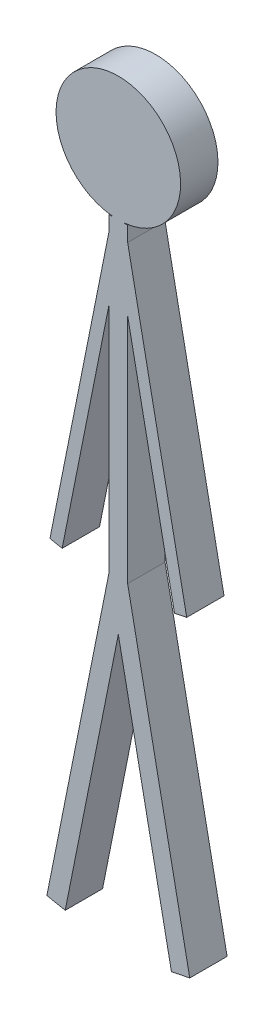
ISO-10303-21;
HEADER;
FILE_DESCRIPTION(('STEP AP214'),'2;1');
FILE_NAME('part.step','',(''),(''),'','','');
FILE_SCHEMA(('AUTOMOTIVE_DESIGN { 1 0 10303 214 1 1 1 1 }'));
ENDSEC;
DATA;
#1=APPLICATION_CONTEXT('core data for automotive mechanical design processes');
#2=APPLICATION_PROTOCOL_DEFINITION('international standard','automotive_design',2000,#1);
#3=PRODUCT_CONTEXT('',#1,'mechanical');
#4=PRODUCT('Part','Part','',(#3));
#5=PRODUCT_RELATED_PRODUCT_CATEGORY('part','',(#4));
#6=PRODUCT_DEFINITION_FORMATION('','',#4);
#7=PRODUCT_DEFINITION_CONTEXT('part definition',#1,'design');
#8=PRODUCT_DEFINITION('design','',#6,#7);
#9=PRODUCT_DEFINITION_SHAPE('','',#8);
#10=(LENGTH_UNIT() NAMED_UNIT(*) SI_UNIT(.MILLI.,.METRE.));
#11=(NAMED_UNIT(*) PLANE_ANGLE_UNIT() SI_UNIT($,.RADIAN.));
#12=(NAMED_UNIT(*) SI_UNIT($,.STERADIAN.) SOLID_ANGLE_UNIT());
#13=UNCERTAINTY_MEASURE_WITH_UNIT(LENGTH_MEASURE(1.E-05),#10,'distance_accuracy_value','');
#14=(GEOMETRIC_REPRESENTATION_CONTEXT(3) GLOBAL_UNCERTAINTY_ASSIGNED_CONTEXT((#13)) GLOBAL_UNIT_ASSIGNED_CONTEXT((#10,
#11,#12)) REPRESENTATION_CONTEXT('',''));
#15=CARTESIAN_POINT('',(0.,0.,0.));
#16=DIRECTION('',(0.,0.,1.));
#17=DIRECTION('',(1.,0.,0.));
#18=AXIS2_PLACEMENT_3D('',#15,#16,#17);
#19=CARTESIAN_POINT('',(1.8680061871912,6.69083844323595,5.715));
#20=DIRECTION('',(0.98058067569092,0.196116135138184,0.));
#21=DIRECTION('',(-0.196116135138184,0.98058067569092,0.));
#22=AXIS2_PLACEMENT_3D('',#19,#20,#21);
#23=PLANE('',#22);
#24=DIRECTION('',(0.,0.,-1.));
#25=VECTOR('',#24,1.);
#26=CARTESIAN_POINT('',(2.8575,1.74336937919196,5.715));
#27=LINE('',#26,#25);
#28=CARTESIAN_POINT('',(2.8575,1.74336937919196,5.715));
#29=VERTEX_POINT('',#28);
#30=CARTESIAN_POINT('',(2.8575,1.74336937919196,-5.715));
#31=VERTEX_POINT('',#30);
#32=EDGE_CURVE('E343',#29,#31,#27,.T.);
#33=ORIENTED_EDGE('',*,*,#32,.F.);
#34=DIRECTION('',(0.196116135138184,-0.98058067569092,0.));
#35=VECTOR('',#34,1.);
#36=CARTESIAN_POINT('',(1.8680061871912,6.69083844323595,5.715));
#37=LINE('',#36,#35);
#38=CARTESIAN_POINT('',(20.9180061871912,-88.5591615567641,5.715));
#39=VERTEX_POINT('',#38);
#40=EDGE_CURVE('E276',#29,#39,#37,.T.);
#41=ORIENTED_EDGE('',*,*,#40,.T.);
#42=DIRECTION('',(0.,0.,-1.));
#43=VECTOR('',#42,1.);
#44=CARTESIAN_POINT('',(20.9180061871912,-88.5591615567641,5.715));
#45=LINE('',#44,#43);
#46=CARTESIAN_POINT('',(20.9180061871912,-88.5591615567641,-5.715));
#47=VERTEX_POINT('',#46);
#48=EDGE_CURVE('E355',#39,#47,#45,.T.);
#49=ORIENTED_EDGE('',*,*,#48,.T.);
#50=DIRECTION('',(0.196116135138184,-0.98058067569092,0.));
#51=VECTOR('',#50,1.);
#52=CARTESIAN_POINT('',(1.8680061871912,6.69083844323595,-5.715));
#53=LINE('',#52,#51);
#54=EDGE_CURVE('E123',#31,#47,#53,.T.);
#55=ORIENTED_EDGE('',*,*,#54,.F.);
#56=EDGE_LOOP('',(#33,#41,#49,#55));
#57=FACE_BOUND('',#56,.T.);
#58=ADVANCED_FACE('F108',(#57),#23,.T.);
#59=CARTESIAN_POINT('',(-1.8680061871912,6.69083844323595,5.715));
#60=DIRECTION('',(0.98058067569092,-0.196116135138184,0.));
#61=DIRECTION('',(0.196116135138184,0.98058067569092,0.));
#62=AXIS2_PLACEMENT_3D('',#59,#60,#61);
#63=PLANE('',#62);
#64=DIRECTION('',(0.,0.,1.));
#65=VECTOR('',#64,1.);
#66=CARTESIAN_POINT('',(-2.8575,1.74336937919197,5.715));
#67=LINE('',#66,#65);
#68=CARTESIAN_POINT('',(-2.8575,1.74336937919197,-5.715));
#69=VERTEX_POINT('',#68);
#70=CARTESIAN_POINT('',(-2.8575,1.74336937919197,5.715));
#71=VERTEX_POINT('',#70);
#72=EDGE_CURVE('E338',#69,#71,#67,.T.);
#73=ORIENTED_EDGE('',*,*,#72,.F.);
#74=DIRECTION('',(-0.196116135138184,-0.98058067569092,0.));
#75=VECTOR('',#74,1.);
#76=CARTESIAN_POINT('',(-1.8680061871912,6.69083844323595,-5.715));
#77=LINE('',#76,#75);
#78=CARTESIAN_POINT('',(-20.9180061871912,-88.5591615567641,-5.715));
#79=VERTEX_POINT('',#78);
#80=EDGE_CURVE('E346',#69,#79,#77,.T.);
#81=ORIENTED_EDGE('',*,*,#80,.T.);
#82=DIRECTION('',(0.,0.,-1.));
#83=VECTOR('',#82,1.);
#84=CARTESIAN_POINT('',(-20.9180061871912,-88.5591615567641,5.715));
#85=LINE('',#84,#83);
#86=CARTESIAN_POINT('',(-20.9180061871912,-88.5591615567641,5.715));
#87=VERTEX_POINT('',#86);
#88=EDGE_CURVE('E359',#87,#79,#85,.T.);
#89=ORIENTED_EDGE('',*,*,#88,.F.);
#90=DIRECTION('',(-0.196116135138184,-0.98058067569092,0.));
#91=VECTOR('',#90,1.);
#92=CARTESIAN_POINT('',(-1.8680061871912,6.69083844323595,5.715));
#93=LINE('',#92,#91);
#94=EDGE_CURVE('E371',#71,#87,#93,.T.);
#95=ORIENTED_EDGE('',*,*,#94,.F.);
#96=EDGE_LOOP('',(#73,#81,#89,#95));
#97=FACE_BOUND('',#96,.T.);
#98=ADVANCED_FACE('F459',(#97),#63,.F.);
#99=CARTESIAN_POINT('',(1.8680061871912,5.94363596835947,5.715));
#100=DIRECTION('',(0.98058067569092,-0.196116135138184,0.));
#101=DIRECTION('',(0.196116135138184,0.98058067569092,0.));
#102=AXIS2_PLACEMENT_3D('',#99,#100,#101);
#103=PLANE('',#102);
#104=DIRECTION('',(-0.196116135138184,-0.98058067569092,0.));
#105=VECTOR('',#104,1.);
#106=CARTESIAN_POINT('',(1.8680061871912,5.94363596835947,-5.715));
#107=LINE('',#106,#105);
#108=CARTESIAN_POINT('',(-2.8575,-17.6838949675965,-5.715));
#109=VERTEX_POINT('',#108);
#110=CARTESIAN_POINT('',(-17.1819938128088,-89.3063640316406,-5.715));
#111=VERTEX_POINT('',#110);
#112=EDGE_CURVE('E383',#109,#111,#107,.T.);
#113=ORIENTED_EDGE('',*,*,#112,.F.);
#114=DIRECTION('',(0.,0.,1.));
#115=VECTOR('',#114,1.);
#116=CARTESIAN_POINT('',(-2.8575,-17.6838949675965,5.715));
#117=LINE('',#116,#115);
#118=CARTESIAN_POINT('',(-2.8575,-17.6838949675965,5.715));
#119=VERTEX_POINT('',#118);
#120=EDGE_CURVE('E397',#109,#119,#117,.T.);
#121=ORIENTED_EDGE('',*,*,#120,.T.);
#122=DIRECTION('',(-0.196116135138184,-0.98058067569092,0.));
#123=VECTOR('',#122,1.);
#124=CARTESIAN_POINT('',(1.8680061871912,5.94363596835947,5.715));
#125=LINE('',#124,#123);
#126=CARTESIAN_POINT('',(-17.1819938128088,-89.3063640316406,5.715));
#127=VERTEX_POINT('',#126);
#128=EDGE_CURVE('E374',#119,#127,#125,.T.);
#129=ORIENTED_EDGE('',*,*,#128,.T.);
#130=DIRECTION('',(0.,0.,-1.));
#131=VECTOR('',#130,1.);
#132=CARTESIAN_POINT('',(-17.1819938128088,-89.3063640316406,5.715));
#133=LINE('',#132,#131);
#134=EDGE_CURVE('E376',#127,#111,#133,.T.);
#135=ORIENTED_EDGE('',*,*,#134,.T.);
#136=EDGE_LOOP('',(#113,#121,#129,#135));
#137=FACE_BOUND('',#136,.T.);
#138=ADVANCED_FACE('F451',(#137),#103,.T.);
#139=CARTESIAN_POINT('',(0.,25.3672372057977,5.715));
#140=DIRECTION('',(0.,0.,-1.));
#141=DIRECTION('',(-1.,0.,0.));
#142=AXIS2_PLACEMENT_3D('',#139,#140,#141);
#143=CYLINDRICAL_SURFACE('',#142,19.05);
#144=CARTESIAN_POINT('',(0.,25.3672372057977,5.715));
#145=DIRECTION('',(0.,0.,1.));
#146=DIRECTION('',(1.,0.,0.));
#147=AXIS2_PLACEMENT_3D('',#144,#145,#146);
#148=CIRCLE('',#147,19.05);
#149=CARTESIAN_POINT('',(1.92325975811923,6.41457058859581,5.715));
#150=VERTEX_POINT('',#149);
#151=CARTESIAN_POINT('',(-1.92325975811923,6.41457058859581,5.715));
#152=VERTEX_POINT('',#151);
#153=EDGE_CURVE('E394',#150,#152,#148,.T.);
#154=ORIENTED_EDGE('',*,*,#153,.F.);
#155=DIRECTION('',(0.,0.,-1.));
#156=VECTOR('',#155,1.);
#157=CARTESIAN_POINT('',(1.92325975811923,6.41457058859581,5.715));
#158=LINE('',#157,#156);
#159=CARTESIAN_POINT('',(1.92325975811923,6.41457058859581,-5.715));
#160=VERTEX_POINT('',#159);
#161=EDGE_CURVE('E391',#150,#160,#158,.T.);
#162=ORIENTED_EDGE('',*,*,#161,.T.);
#163=CARTESIAN_POINT('',(0.,25.3672372057977,-5.715));
#164=DIRECTION('',(0.,0.,1.));
#165=DIRECTION('',(1.,0.,0.));
#166=AXIS2_PLACEMENT_3D('',#163,#164,#165);
#167=CIRCLE('',#166,19.05);
#168=CARTESIAN_POINT('',(-1.92325975811923,6.41457058859581,-5.715));
#169=VERTEX_POINT('',#168);
#170=EDGE_CURVE('E393',#160,#169,#167,.T.);
#171=ORIENTED_EDGE('',*,*,#170,.T.);
#172=DIRECTION('',(0.,0.,-1.));
#173=VECTOR('',#172,1.);
#174=CARTESIAN_POINT('',(-1.92325975811923,6.41457058859581,5.715));
#175=LINE('',#174,#173);
#176=EDGE_CURVE('E367',#152,#169,#175,.T.);
#177=ORIENTED_EDGE('',*,*,#176,.F.);
#178=EDGE_LOOP('',(#154,#162,#171,#177));
#179=FACE_BOUND('',#178,.T.);
#180=ADVANCED_FACE('F110',(#179),#143,.T.);
#181=CARTESIAN_POINT('',(0.,25.3672372057977,5.715));
#182=DIRECTION('',(0.,0.,1.));
#183=DIRECTION('',(1.,0.,0.));
#184=AXIS2_PLACEMENT_3D('',#181,#182,#183);
#185=PLANE('',#184);
#186=CARTESIAN_POINT('',(-1.94272643467885,6.31723720579771,5.715));
#187=VERTEX_POINT('',#186);
#188=EDGE_CURVE('E368',#152,#187,#93,.T.);
#189=ORIENTED_EDGE('',*,*,#188,.T.);
#190=DIRECTION('',(1.,0.,0.));
#191=VECTOR('',#190,1.);
#192=CARTESIAN_POINT('',(-2.8575,6.31723720579771,5.715));
#193=LINE('',#192,#191);
#194=CARTESIAN_POINT('',(-2.8575,6.31723720579771,5.715));
#195=VERTEX_POINT('',#194);
#196=EDGE_CURVE('E262',#195,#187,#193,.T.);
#197=ORIENTED_EDGE('',*,*,#196,.F.);
#198=DIRECTION('',(0.,-1.,0.));
#199=VECTOR('',#198,1.);
#200=CARTESIAN_POINT('',(-2.8575,6.31723720579771,5.715));
#201=LINE('',#200,#199);
#202=EDGE_CURVE('E279',#195,#71,#201,.T.);
#203=ORIENTED_EDGE('',*,*,#202,.T.);
#204=ORIENTED_EDGE('',*,*,#94,.T.);
#205=DIRECTION('',(-0.98058067569092,0.196116135138186,0.));
#206=VECTOR('',#205,1.);
#207=CARTESIAN_POINT('',(-17.1819938128088,-89.3063640316406,5.715));
#208=LINE('',#207,#206);
#209=EDGE_CURVE('E370',#127,#87,#208,.T.);
#210=ORIENTED_EDGE('',*,*,#209,.F.);
#211=ORIENTED_EDGE('',*,*,#128,.F.);
#212=CARTESIAN_POINT('',(-2.8575,-88.649814534111,5.715));
#213=VERTEX_POINT('',#212);
#214=EDGE_CURVE('E291',#119,#213,#201,.T.);
#215=ORIENTED_EDGE('',*,*,#214,.T.);
#216=DIRECTION('',(-0.196116135138184,-0.98058067569092,0.));
#217=VECTOR('',#216,1.);
#218=CARTESIAN_POINT('',(-2.8020092807868,-88.3723609380449,5.715));
#219=LINE('',#218,#217);
#220=CARTESIAN_POINT('',(-21.8520092807868,-183.622360938045,5.715));
#221=VERTEX_POINT('',#220);
#222=EDGE_CURVE('E315',#213,#221,#219,.T.);
#223=ORIENTED_EDGE('',*,*,#222,.T.);
#224=DIRECTION('',(-0.980580675690921,0.196116135138182,0.));
#225=VECTOR('',#224,1.);
#226=CARTESIAN_POINT('',(-16.2479907192132,-184.74316465036,5.715));
#227=LINE('',#226,#225);
#228=CARTESIAN_POINT('',(-16.2479907192132,-184.74316465036,5.715));
#229=VERTEX_POINT('',#228);
#230=EDGE_CURVE('E317',#229,#221,#227,.T.);
#231=ORIENTED_EDGE('',*,*,#230,.F.);
#232=DIRECTION('',(-0.196116135138184,-0.98058067569092,0.));
#233=VECTOR('',#232,1.);
#234=CARTESIAN_POINT('',(2.80200928078681,-89.4931646503597,5.715));
#235=LINE('',#234,#233);
#236=CARTESIAN_POINT('',(0.,-103.503211054294,5.715));
#237=VERTEX_POINT('',#236);
#238=EDGE_CURVE('E321',#237,#229,#235,.T.);
#239=ORIENTED_EDGE('',*,*,#238,.F.);
#240=DIRECTION('',(0.196116135138184,-0.98058067569092,0.));
#241=VECTOR('',#240,1.);
#242=CARTESIAN_POINT('',(-2.8020092807868,-89.4931646503597,5.715));
#243=LINE('',#242,#241);
#244=CARTESIAN_POINT('',(16.2479907192132,-184.74316465036,5.715));
#245=VERTEX_POINT('',#244);
#246=EDGE_CURVE('E293',#237,#245,#243,.T.);
#247=ORIENTED_EDGE('',*,*,#246,.T.);
#248=DIRECTION('',(-0.980580675690921,-0.196116135138182,0.));
#249=VECTOR('',#248,1.);
#250=CARTESIAN_POINT('',(21.8520092807868,-183.622360938045,5.715));
#251=LINE('',#250,#249);
#252=CARTESIAN_POINT('',(21.8520092807868,-183.622360938045,5.715));
#253=VERTEX_POINT('',#252);
#254=EDGE_CURVE('E295',#253,#245,#251,.T.);
#255=ORIENTED_EDGE('',*,*,#254,.F.);
#256=DIRECTION('',(0.196116135138184,-0.98058067569092,0.));
#257=VECTOR('',#256,1.);
#258=CARTESIAN_POINT('',(2.80200928078681,-88.3723609380449,5.715));
#259=LINE('',#258,#257);
#260=CARTESIAN_POINT('',(2.85749999999991,-88.64981453411,5.715));
#261=VERTEX_POINT('',#260);
#262=EDGE_CURVE('E299',#261,#253,#259,.T.);
#263=ORIENTED_EDGE('',*,*,#262,.F.);
#264=DIRECTION('',(0.,-1.,0.));
#265=VECTOR('',#264,1.);
#266=CARTESIAN_POINT('',(2.8575,6.31723720579771,5.715));
#267=LINE('',#266,#265);
#268=CARTESIAN_POINT('',(2.8575,-17.6838949675966,5.715));
#269=VERTEX_POINT('',#268);
#270=EDGE_CURVE('E277',#269,#261,#267,.T.);
#271=ORIENTED_EDGE('',*,*,#270,.F.);
#272=DIRECTION('',(0.196116135138184,-0.98058067569092,0.));
#273=VECTOR('',#272,1.);
#274=CARTESIAN_POINT('',(-1.8680061871912,5.94363596835947,5.715));
#275=LINE('',#274,#273);
#276=CARTESIAN_POINT('',(17.1819938128088,-89.3063640316406,5.715));
#277=VERTEX_POINT('',#276);
#278=EDGE_CURVE('E347',#269,#277,#275,.T.);
#279=ORIENTED_EDGE('',*,*,#278,.T.);
#280=DIRECTION('',(-0.98058067569092,-0.196116135138186,0.));
#281=VECTOR('',#280,1.);
#282=CARTESIAN_POINT('',(20.9180061871912,-88.5591615567641,5.715));
#283=LINE('',#282,#281);
#284=EDGE_CURVE('E349',#39,#277,#283,.T.);
#285=ORIENTED_EDGE('',*,*,#284,.F.);
#286=ORIENTED_EDGE('',*,*,#40,.F.);
#287=CARTESIAN_POINT('',(2.8575,6.31723720579771,5.715));
#288=VERTEX_POINT('',#287);
#289=EDGE_CURVE('E263',#288,#29,#267,.T.);
#290=ORIENTED_EDGE('',*,*,#289,.F.);
#291=CARTESIAN_POINT('',(1.94272643467885,6.31723720579771,5.715));
#292=VERTEX_POINT('',#291);
#293=EDGE_CURVE('E253',#292,#288,#193,.T.);
#294=ORIENTED_EDGE('',*,*,#293,.F.);
#295=EDGE_CURVE('E353',#150,#292,#37,.T.);
#296=ORIENTED_EDGE('',*,*,#295,.F.);
#297=ORIENTED_EDGE('',*,*,#153,.T.);
#298=EDGE_LOOP('',(#189,#197,#203,#204,#210,#211,#215,#223,#231,#239,#247,#255,#263,#271,#279,
#285,#286,#290,#294,#296,#297));
#299=FACE_BOUND('',#298,.T.);
#300=ADVANCED_FACE('F274',(#299),#185,.T.);
#301=CARTESIAN_POINT('',(0.,25.3672372057977,-5.715));
#302=DIRECTION('',(0.,0.,1.));
#303=DIRECTION('',(1.,0.,0.));
#304=AXIS2_PLACEMENT_3D('',#301,#302,#303);
#305=PLANE('',#304);
#306=CARTESIAN_POINT('',(1.94272643467885,6.31723720579771,-5.715));
#307=VERTEX_POINT('',#306);
#308=EDGE_CURVE('E350',#160,#307,#53,.T.);
#309=ORIENTED_EDGE('',*,*,#308,.T.);
#310=DIRECTION('',(1.,0.,0.));
#311=VECTOR('',#310,1.);
#312=CARTESIAN_POINT('',(-2.8575,6.31723720579771,-5.715));
#313=LINE('',#312,#311);
#314=CARTESIAN_POINT('',(2.8575,6.31723720579771,-5.715));
#315=VERTEX_POINT('',#314);
#316=EDGE_CURVE('E287',#307,#315,#313,.T.);
#317=ORIENTED_EDGE('',*,*,#316,.T.);
#318=DIRECTION('',(0.,-1.,0.));
#319=VECTOR('',#318,1.);
#320=CARTESIAN_POINT('',(2.8575,6.31723720579771,-5.715));
#321=LINE('',#320,#319);
#322=EDGE_CURVE('E269',#315,#31,#321,.T.);
#323=ORIENTED_EDGE('',*,*,#322,.T.);
#324=ORIENTED_EDGE('',*,*,#54,.T.);
#325=DIRECTION('',(-0.98058067569092,-0.196116135138186,0.));
#326=VECTOR('',#325,1.);
#327=CARTESIAN_POINT('',(20.9180061871912,-88.5591615567641,-5.715));
#328=LINE('',#327,#326);
#329=CARTESIAN_POINT('',(17.1819938128088,-89.3063640316406,-5.715));
#330=VERTEX_POINT('',#329);
#331=EDGE_CURVE('E358',#47,#330,#328,.T.);
#332=ORIENTED_EDGE('',*,*,#331,.T.);
#333=DIRECTION('',(0.196116135138184,-0.98058067569092,0.));
#334=VECTOR('',#333,1.);
#335=CARTESIAN_POINT('',(-1.8680061871912,5.94363596835947,-5.715));
#336=LINE('',#335,#334);
#337=CARTESIAN_POINT('',(2.8575,-17.6838949675966,-5.715));
#338=VERTEX_POINT('',#337);
#339=EDGE_CURVE('E356',#338,#330,#336,.T.);
#340=ORIENTED_EDGE('',*,*,#339,.F.);
#341=CARTESIAN_POINT('',(2.85749999999991,-88.64981453411,-5.715));
#342=VERTEX_POINT('',#341);
#343=EDGE_CURVE('E284',#338,#342,#321,.T.);
#344=ORIENTED_EDGE('',*,*,#343,.T.);
#345=DIRECTION('',(0.196116135138184,-0.98058067569092,0.));
#346=VECTOR('',#345,1.);
#347=CARTESIAN_POINT('',(2.80200928078681,-88.3723609380449,-5.715));
#348=LINE('',#347,#346);
#349=CARTESIAN_POINT('',(21.8520092807868,-183.622360938045,-5.715));
#350=VERTEX_POINT('',#349);
#351=EDGE_CURVE('E296',#342,#350,#348,.T.);
#352=ORIENTED_EDGE('',*,*,#351,.T.);
#353=DIRECTION('',(-0.980580675690921,-0.196116135138182,0.));
#354=VECTOR('',#353,1.);
#355=CARTESIAN_POINT('',(21.8520092807868,-183.622360938045,-5.715));
#356=LINE('',#355,#354);
#357=CARTESIAN_POINT('',(16.2479907192132,-184.74316465036,-5.715));
#358=VERTEX_POINT('',#357);
#359=EDGE_CURVE('E304',#350,#358,#356,.T.);
#360=ORIENTED_EDGE('',*,*,#359,.T.);
#361=DIRECTION('',(0.196116135138184,-0.98058067569092,0.));
#362=VECTOR('',#361,1.);
#363=CARTESIAN_POINT('',(-2.8020092807868,-89.4931646503597,-5.715));
#364=LINE('',#363,#362);
#365=CARTESIAN_POINT('',(0.,-103.503211054294,-5.715));
#366=VERTEX_POINT('',#365);
#367=EDGE_CURVE('E302',#366,#358,#364,.T.);
#368=ORIENTED_EDGE('',*,*,#367,.F.);
#369=DIRECTION('',(-0.196116135138184,-0.98058067569092,0.));
#370=VECTOR('',#369,1.);
#371=CARTESIAN_POINT('',(2.80200928078681,-89.4931646503597,-5.715));
#372=LINE('',#371,#370);
#373=CARTESIAN_POINT('',(-16.2479907192132,-184.74316465036,-5.715));
#374=VERTEX_POINT('',#373);
#375=EDGE_CURVE('E318',#366,#374,#372,.T.);
#376=ORIENTED_EDGE('',*,*,#375,.T.);
#377=DIRECTION('',(-0.980580675690921,0.196116135138182,0.));
#378=VECTOR('',#377,1.);
#379=CARTESIAN_POINT('',(-16.2479907192132,-184.74316465036,-5.715));
#380=LINE('',#379,#378);
#381=CARTESIAN_POINT('',(-21.8520092807868,-183.622360938045,-5.715));
#382=VERTEX_POINT('',#381);
#383=EDGE_CURVE('E326',#374,#382,#380,.T.);
#384=ORIENTED_EDGE('',*,*,#383,.T.);
#385=DIRECTION('',(-0.196116135138184,-0.98058067569092,0.));
#386=VECTOR('',#385,1.);
#387=CARTESIAN_POINT('',(-2.8020092807868,-88.3723609380449,-5.715));
#388=LINE('',#387,#386);
#389=CARTESIAN_POINT('',(-2.8575,-88.649814534111,-5.715));
#390=VERTEX_POINT('',#389);
#391=EDGE_CURVE('E324',#390,#382,#388,.T.);
#392=ORIENTED_EDGE('',*,*,#391,.F.);
#393=DIRECTION('',(0.,-1.,0.));
#394=VECTOR('',#393,1.);
#395=CARTESIAN_POINT('',(-2.8575,6.31723720579771,-5.715));
#396=LINE('',#395,#394);
#397=EDGE_CURVE('E285',#109,#390,#396,.T.);
#398=ORIENTED_EDGE('',*,*,#397,.F.);
#399=ORIENTED_EDGE('',*,*,#112,.T.);
#400=DIRECTION('',(-0.98058067569092,0.196116135138186,0.));
#401=VECTOR('',#400,1.);
#402=CARTESIAN_POINT('',(-17.1819938128088,-89.3063640316406,-5.715));
#403=LINE('',#402,#401);
#404=EDGE_CURVE('E380',#111,#79,#403,.T.);
#405=ORIENTED_EDGE('',*,*,#404,.T.);
#406=ORIENTED_EDGE('',*,*,#80,.F.);
#407=CARTESIAN_POINT('',(-2.8575,6.31723720579771,-5.715));
#408=VERTEX_POINT('',#407);
#409=EDGE_CURVE('E282',#408,#69,#396,.T.);
#410=ORIENTED_EDGE('',*,*,#409,.F.);
#411=CARTESIAN_POINT('',(-1.94272643467885,6.31723720579771,-5.715));
#412=VERTEX_POINT('',#411);
#413=EDGE_CURVE('E288',#408,#412,#313,.T.);
#414=ORIENTED_EDGE('',*,*,#413,.T.);
#415=EDGE_CURVE('E377',#169,#412,#77,.T.);
#416=ORIENTED_EDGE('',*,*,#415,.F.);
#417=ORIENTED_EDGE('',*,*,#170,.F.);
#418=EDGE_LOOP('',(#309,#317,#323,#324,#332,#340,#344,#352,#360,#368,#376,#384,#392,#398,#399,
#405,#406,#410,#414,#416,#417));
#419=FACE_BOUND('',#418,.T.);
#420=ADVANCED_FACE('F409',(#419),#305,.F.);
#421=DIRECTION('',(0.,0.,1.));
#422=VECTOR('',#421,1.);
#423=CARTESIAN_POINT('',(1.94272643467885,6.31723720579771,5.715));
#424=LINE('',#423,#422);
#425=EDGE_CURVE('E131',#307,#292,#424,.T.);
#426=ORIENTED_EDGE('',*,*,#425,.F.);
#427=ORIENTED_EDGE('',*,*,#308,.F.);
#428=ORIENTED_EDGE('',*,*,#161,.F.);
#429=ORIENTED_EDGE('',*,*,#295,.T.);
#430=EDGE_LOOP('',(#426,#427,#428,#429));
#431=FACE_BOUND('',#430,.T.);
#432=ADVANCED_FACE('F474',(#431),#23,.T.);
#433=ORIENTED_EDGE('',*,*,#415,.T.);
#434=DIRECTION('',(0.,0.,1.));
#435=VECTOR('',#434,1.);
#436=CARTESIAN_POINT('',(-1.94272643467885,6.31723720579771,5.715));
#437=LINE('',#436,#435);
#438=EDGE_CURVE('E12',#412,#187,#437,.T.);
#439=ORIENTED_EDGE('',*,*,#438,.T.);
#440=ORIENTED_EDGE('',*,*,#188,.F.);
#441=ORIENTED_EDGE('',*,*,#176,.T.);
#442=EDGE_LOOP('',(#433,#439,#440,#441));
#443=FACE_BOUND('',#442,.T.);
#444=ADVANCED_FACE('F470',(#443),#63,.F.);
#445=CARTESIAN_POINT('',(-1.8680061871912,5.94363596835947,5.715));
#446=DIRECTION('',(0.98058067569092,0.196116135138184,0.));
#447=DIRECTION('',(-0.196116135138184,0.98058067569092,0.));
#448=AXIS2_PLACEMENT_3D('',#445,#446,#447);
#449=PLANE('',#448);
#450=ORIENTED_EDGE('',*,*,#278,.F.);
#451=DIRECTION('',(0.,0.,-1.));
#452=VECTOR('',#451,1.);
#453=CARTESIAN_POINT('',(2.8575,-17.6838949675966,5.715));
#454=LINE('',#453,#452);
#455=EDGE_CURVE('E116',#269,#338,#454,.T.);
#456=ORIENTED_EDGE('',*,*,#455,.T.);
#457=ORIENTED_EDGE('',*,*,#339,.T.);
#458=DIRECTION('',(0.,0.,-1.));
#459=VECTOR('',#458,1.);
#460=CARTESIAN_POINT('',(17.1819938128088,-89.3063640316406,5.715));
#461=LINE('',#460,#459);
#462=EDGE_CURVE('E364',#277,#330,#461,.T.);
#463=ORIENTED_EDGE('',*,*,#462,.F.);
#464=EDGE_LOOP('',(#450,#456,#457,#463));
#465=FACE_BOUND('',#464,.T.);
#466=ADVANCED_FACE('F403',(#465),#449,.F.);
#467=CARTESIAN_POINT('',(20.9180061871912,-88.5591615567641,5.715));
#468=DIRECTION('',(0.196116135138186,-0.98058067569092,0.));
#469=DIRECTION('',(0.98058067569092,0.196116135138186,0.));
#470=AXIS2_PLACEMENT_3D('',#467,#468,#469);
#471=PLANE('',#470);
#472=ORIENTED_EDGE('',*,*,#331,.F.);
#473=ORIENTED_EDGE('',*,*,#48,.F.);
#474=ORIENTED_EDGE('',*,*,#284,.T.);
#475=ORIENTED_EDGE('',*,*,#462,.T.);
#476=EDGE_LOOP('',(#472,#473,#474,#475));
#477=FACE_BOUND('',#476,.T.);
#478=ADVANCED_FACE('F477',(#477),#471,.T.);
#479=CARTESIAN_POINT('',(-17.1819938128088,-89.3063640316406,5.715));
#480=DIRECTION('',(-0.196116135138186,-0.98058067569092,0.));
#481=DIRECTION('',(0.98058067569092,-0.196116135138186,0.));
#482=AXIS2_PLACEMENT_3D('',#479,#480,#481);
#483=PLANE('',#482);
#484=ORIENTED_EDGE('',*,*,#404,.F.);
#485=ORIENTED_EDGE('',*,*,#134,.F.);
#486=ORIENTED_EDGE('',*,*,#209,.T.);
#487=ORIENTED_EDGE('',*,*,#88,.T.);
#488=EDGE_LOOP('',(#484,#485,#486,#487));
#489=FACE_BOUND('',#488,.T.);
#490=ADVANCED_FACE('F454',(#489),#483,.T.);
#491=CARTESIAN_POINT('',(2.80200928078681,-88.3723609380449,5.715));
#492=DIRECTION('',(0.98058067569092,0.196116135138184,0.));
#493=DIRECTION('',(-0.196116135138184,0.98058067569092,0.));
#494=AXIS2_PLACEMENT_3D('',#491,#492,#493);
#495=PLANE('',#494);
#496=ORIENTED_EDGE('',*,*,#351,.F.);
#497=DIRECTION('',(0.,0.,1.));
#498=VECTOR('',#497,1.);
#499=CARTESIAN_POINT('',(2.85750000000001,-88.6498145341109,5.715));
#500=LINE('',#499,#498);
#501=EDGE_CURVE('E270',#342,#261,#500,.T.);
#502=ORIENTED_EDGE('',*,*,#501,.T.);
#503=ORIENTED_EDGE('',*,*,#262,.T.);
#504=DIRECTION('',(0.,0.,-1.));
#505=VECTOR('',#504,1.);
#506=CARTESIAN_POINT('',(21.8520092807868,-183.622360938045,5.715));
#507=LINE('',#506,#505);
#508=EDGE_CURVE('E301',#253,#350,#507,.T.);
#509=ORIENTED_EDGE('',*,*,#508,.T.);
#510=EDGE_LOOP('',(#496,#502,#503,#509));
#511=FACE_BOUND('',#510,.T.);
#512=ADVANCED_FACE('F416',(#511),#495,.T.);
#513=CARTESIAN_POINT('',(21.8520092807868,-183.622360938045,5.715));
#514=DIRECTION('',(0.196116135138182,-0.98058067569092,0.));
#515=DIRECTION('',(0.980580675690921,0.196116135138182,0.));
#516=AXIS2_PLACEMENT_3D('',#513,#514,#515);
#517=PLANE('',#516);
#518=ORIENTED_EDGE('',*,*,#359,.F.);
#519=ORIENTED_EDGE('',*,*,#508,.F.);
#520=ORIENTED_EDGE('',*,*,#254,.T.);
#521=DIRECTION('',(0.,0.,-1.));
#522=VECTOR('',#521,1.);
#523=CARTESIAN_POINT('',(16.2479907192132,-184.74316465036,5.715));
#524=LINE('',#523,#522);
#525=EDGE_CURVE('E311',#245,#358,#524,.T.);
#526=ORIENTED_EDGE('',*,*,#525,.T.);
#527=EDGE_LOOP('',(#518,#519,#520,#526));
#528=FACE_BOUND('',#527,.T.);
#529=ADVANCED_FACE('F421',(#528),#517,.T.);
#530=CARTESIAN_POINT('',(-2.8020092807868,-89.4931646503597,5.715));
#531=DIRECTION('',(0.98058067569092,0.196116135138184,0.));
#532=DIRECTION('',(-0.196116135138184,0.98058067569092,0.));
#533=AXIS2_PLACEMENT_3D('',#530,#531,#532);
#534=PLANE('',#533);
#535=ORIENTED_EDGE('',*,*,#246,.F.);
#536=DIRECTION('',(0.,0.,-1.));
#537=VECTOR('',#536,1.);
#538=CARTESIAN_POINT('',(0.,-103.503211054294,5.715));
#539=LINE('',#538,#537);
#540=EDGE_CURVE('E314',#237,#366,#539,.T.);
#541=ORIENTED_EDGE('',*,*,#540,.T.);
#542=ORIENTED_EDGE('',*,*,#367,.T.);
#543=ORIENTED_EDGE('',*,*,#525,.F.);
#544=EDGE_LOOP('',(#535,#541,#542,#543));
#545=FACE_BOUND('',#544,.T.);
#546=ADVANCED_FACE('F426',(#545),#534,.F.);
#547=CARTESIAN_POINT('',(-2.8020092807868,-88.3723609380449,5.715));
#548=DIRECTION('',(0.98058067569092,-0.196116135138184,0.));
#549=DIRECTION('',(0.196116135138184,0.98058067569092,0.));
#550=AXIS2_PLACEMENT_3D('',#547,#548,#549);
#551=PLANE('',#550);
#552=ORIENTED_EDGE('',*,*,#222,.F.);
#553=DIRECTION('',(0.,0.,-1.));
#554=VECTOR('',#553,1.);
#555=CARTESIAN_POINT('',(-2.85749999999999,-88.6498145341109,5.715));
#556=LINE('',#555,#554);
#557=EDGE_CURVE('E335',#213,#390,#556,.T.);
#558=ORIENTED_EDGE('',*,*,#557,.T.);
#559=ORIENTED_EDGE('',*,*,#391,.T.);
#560=DIRECTION('',(0.,0.,-1.));
#561=VECTOR('',#560,1.);
#562=CARTESIAN_POINT('',(-21.8520092807868,-183.622360938045,5.715));
#563=LINE('',#562,#561);
#564=EDGE_CURVE('E305',#221,#382,#563,.T.);
#565=ORIENTED_EDGE('',*,*,#564,.F.);
#566=EDGE_LOOP('',(#552,#558,#559,#565));
#567=FACE_BOUND('',#566,.T.);
#568=ADVANCED_FACE('F441',(#567),#551,.F.);
#569=CARTESIAN_POINT('',(2.80200928078681,-89.4931646503597,5.715));
#570=DIRECTION('',(0.98058067569092,-0.196116135138184,0.));
#571=DIRECTION('',(0.196116135138184,0.98058067569092,0.));
#572=AXIS2_PLACEMENT_3D('',#569,#570,#571);
#573=PLANE('',#572);
#574=ORIENTED_EDGE('',*,*,#540,.F.);
#575=ORIENTED_EDGE('',*,*,#238,.T.);
#576=DIRECTION('',(0.,0.,-1.));
#577=VECTOR('',#576,1.);
#578=CARTESIAN_POINT('',(-16.2479907192132,-184.74316465036,5.715));
#579=LINE('',#578,#577);
#580=EDGE_CURVE('E323',#229,#374,#579,.T.);
#581=ORIENTED_EDGE('',*,*,#580,.T.);
#582=ORIENTED_EDGE('',*,*,#375,.F.);
#583=EDGE_LOOP('',(#574,#575,#581,#582));
#584=FACE_BOUND('',#583,.T.);
#585=ADVANCED_FACE('F430',(#584),#573,.T.);
#586=CARTESIAN_POINT('',(-16.2479907192132,-184.74316465036,5.715));
#587=DIRECTION('',(-0.196116135138182,-0.98058067569092,0.));
#588=DIRECTION('',(0.980580675690921,-0.196116135138182,0.));
#589=AXIS2_PLACEMENT_3D('',#586,#587,#588);
#590=PLANE('',#589);
#591=ORIENTED_EDGE('',*,*,#383,.F.);
#592=ORIENTED_EDGE('',*,*,#580,.F.);
#593=ORIENTED_EDGE('',*,*,#230,.T.);
#594=ORIENTED_EDGE('',*,*,#564,.T.);
#595=EDGE_LOOP('',(#591,#592,#593,#594));
#596=FACE_BOUND('',#595,.T.);
#597=ADVANCED_FACE('F436',(#596),#590,.T.);
#598=CARTESIAN_POINT('',(-2.8575,6.31723720579771,5.715));
#599=DIRECTION('',(1.,0.,0.));
#600=DIRECTION('',(0.,1.,0.));
#601=AXIS2_PLACEMENT_3D('',#598,#599,#600);
#602=PLANE('',#601);
#603=ORIENTED_EDGE('',*,*,#120,.F.);
#604=ORIENTED_EDGE('',*,*,#397,.T.);
#605=ORIENTED_EDGE('',*,*,#557,.F.);
#606=ORIENTED_EDGE('',*,*,#214,.F.);
#607=EDGE_LOOP('',(#603,#604,#605,#606));
#608=FACE_BOUND('',#607,.T.);
#609=ADVANCED_FACE('F446',(#608),#602,.F.);
#610=CARTESIAN_POINT('',(2.8575,6.31723720579771,5.715));
#611=DIRECTION('',(1.,0.,0.));
#612=DIRECTION('',(0.,1.,0.));
#613=AXIS2_PLACEMENT_3D('',#610,#611,#612);
#614=PLANE('',#613);
#615=ORIENTED_EDGE('',*,*,#455,.F.);
#616=ORIENTED_EDGE('',*,*,#270,.T.);
#617=ORIENTED_EDGE('',*,*,#501,.F.);
#618=ORIENTED_EDGE('',*,*,#343,.F.);
#619=EDGE_LOOP('',(#615,#616,#617,#618));
#620=FACE_BOUND('',#619,.T.);
#621=ADVANCED_FACE('F412',(#620),#614,.T.);
#622=ORIENTED_EDGE('',*,*,#409,.T.);
#623=ORIENTED_EDGE('',*,*,#72,.T.);
#624=ORIENTED_EDGE('',*,*,#202,.F.);
#625=DIRECTION('',(0.,0.,-1.));
#626=VECTOR('',#625,1.);
#627=CARTESIAN_POINT('',(-2.8575,6.31723720579771,5.715));
#628=LINE('',#627,#626);
#629=EDGE_CURVE('E271',#195,#408,#628,.T.);
#630=ORIENTED_EDGE('',*,*,#629,.T.);
#631=EDGE_LOOP('',(#622,#623,#624,#630));
#632=FACE_BOUND('',#631,.T.);
#633=ADVANCED_FACE('F478',(#632),#602,.F.);
#634=CARTESIAN_POINT('',(-2.8575,6.31723720579771,5.715));
#635=DIRECTION('',(0.,1.,0.));
#636=DIRECTION('',(0.,0.,1.));
#637=AXIS2_PLACEMENT_3D('',#634,#635,#636);
#638=PLANE('',#637);
#639=ORIENTED_EDGE('',*,*,#438,.F.);
#640=ORIENTED_EDGE('',*,*,#413,.F.);
#641=ORIENTED_EDGE('',*,*,#629,.F.);
#642=ORIENTED_EDGE('',*,*,#196,.T.);
#643=EDGE_LOOP('',(#639,#640,#641,#642));
#644=FACE_BOUND('',#643,.T.);
#645=ADVANCED_FACE('F465',(#644),#638,.T.);
#646=ORIENTED_EDGE('',*,*,#289,.T.);
#647=ORIENTED_EDGE('',*,*,#32,.T.);
#648=ORIENTED_EDGE('',*,*,#322,.F.);
#649=DIRECTION('',(0.,0.,-1.));
#650=VECTOR('',#649,1.);
#651=CARTESIAN_POINT('',(2.8575,6.31723720579771,5.715));
#652=LINE('',#651,#650);
#653=EDGE_CURVE('E257',#288,#315,#652,.T.);
#654=ORIENTED_EDGE('',*,*,#653,.F.);
#655=EDGE_LOOP('',(#646,#647,#648,#654));
#656=FACE_BOUND('',#655,.T.);
#657=ADVANCED_FACE('F267',(#656),#614,.T.);
#658=ORIENTED_EDGE('',*,*,#316,.F.);
#659=ORIENTED_EDGE('',*,*,#425,.T.);
#660=ORIENTED_EDGE('',*,*,#293,.T.);
#661=ORIENTED_EDGE('',*,*,#653,.T.);
#662=EDGE_LOOP('',(#658,#659,#660,#661));
#663=FACE_BOUND('',#662,.T.);
#664=ADVANCED_FACE('F256',(#663),#638,.T.);
#665=CLOSED_SHELL('',(#58,#98,#138,#180,#300,#420,#432,#444,#466,#478,#490,#512,#529,#546,#568,
#585,#597,#609,#621,#633,#645,#657,#664));
#666=MANIFOLD_SOLID_BREP('B2',#665);
#667=ADVANCED_BREP_SHAPE_REPRESENTATION('',(#18,#666),#14);
#668=SHAPE_DEFINITION_REPRESENTATION(#9,#667);
ENDSEC;
END-ISO-10303-21;
